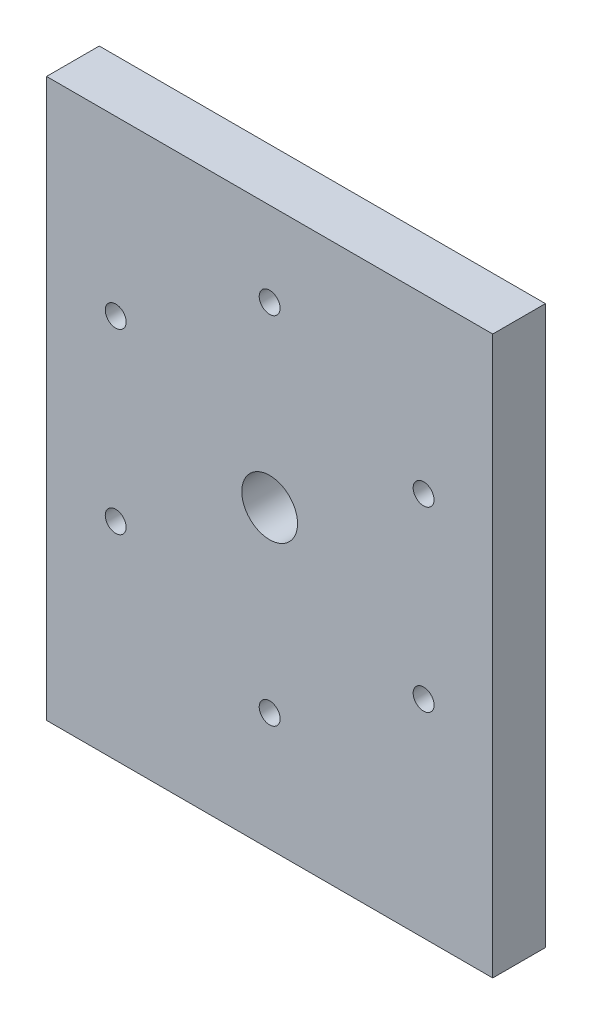
ISO-10303-21;
HEADER;
FILE_DESCRIPTION(('STEP AP214'),'2;1');
FILE_NAME('part.step','',(''),(''),'','','');
FILE_SCHEMA(('AUTOMOTIVE_DESIGN { 1 0 10303 214 1 1 1 1 }'));
ENDSEC;
DATA;
#1=APPLICATION_CONTEXT('core data for automotive mechanical design processes');
#2=APPLICATION_PROTOCOL_DEFINITION('international standard','automotive_design',2000,#1);
#3=PRODUCT_CONTEXT('',#1,'mechanical');
#4=PRODUCT('Part','Part','',(#3));
#5=PRODUCT_RELATED_PRODUCT_CATEGORY('part','',(#4));
#6=PRODUCT_DEFINITION_FORMATION('','',#4);
#7=PRODUCT_DEFINITION_CONTEXT('part definition',#1,'design');
#8=PRODUCT_DEFINITION('design','',#6,#7);
#9=PRODUCT_DEFINITION_SHAPE('','',#8);
#10=(LENGTH_UNIT() NAMED_UNIT(*) SI_UNIT(.MILLI.,.METRE.));
#11=(NAMED_UNIT(*) PLANE_ANGLE_UNIT() SI_UNIT($,.RADIAN.));
#12=(NAMED_UNIT(*) SI_UNIT($,.STERADIAN.) SOLID_ANGLE_UNIT());
#13=UNCERTAINTY_MEASURE_WITH_UNIT(LENGTH_MEASURE(1.E-05),#10,'distance_accuracy_value','');
#14=(GEOMETRIC_REPRESENTATION_CONTEXT(3) GLOBAL_UNCERTAINTY_ASSIGNED_CONTEXT((#13)) GLOBAL_UNIT_ASSIGNED_CONTEXT((#10,
#11,#12)) REPRESENTATION_CONTEXT('',''));
#15=CARTESIAN_POINT('',(0.,0.,0.));
#16=DIRECTION('',(0.,0.,1.));
#17=DIRECTION('',(1.,0.,0.));
#18=AXIS2_PLACEMENT_3D('',#15,#16,#17);
#19=CARTESIAN_POINT('',(0.,0.,12.0000014));
#20=DIRECTION('',(0.,0.,1.));
#21=DIRECTION('',(1.,0.,0.));
#22=AXIS2_PLACEMENT_3D('',#19,#20,#21);
#23=PLANE('',#22);
#24=CARTESIAN_POINT('',(-35.0577908769486,87.6156236000004,12.0000014));
#25=DIRECTION('',(0.,0.,-1.));
#26=DIRECTION('',(-0.50000000000001,-0.866025403784433,0.));
#27=AXIS2_PLACEMENT_3D('',#24,#25,#26);
#28=CIRCLE('',#27,2.38125);
#29=CARTESIAN_POINT('',(-36.2484158769486,85.5534006072387,12.0000014));
#30=VERTEX_POINT('',#29);
#31=EDGE_CURVE('E133',#30,#30,#28,.T.);
#32=ORIENTED_EDGE('',*,*,#31,.T.);
#33=EDGE_LOOP('',(#32));
#34=FACE_BOUND('',#33,.T.);
#35=CARTESIAN_POINT('',(-35.057790876949,47.1343736000003,12.0000014));
#36=DIRECTION('',(0.,0.,-1.));
#37=DIRECTION('',(0.499999999999992,-0.866025403784443,0.));
#38=AXIS2_PLACEMENT_3D('',#35,#36,#37);
#39=CIRCLE('',#38,2.38125);
#40=CARTESIAN_POINT('',(-33.867165876949,45.0721506072386,12.0000014));
#41=VERTEX_POINT('',#40);
#42=EDGE_CURVE('E140',#41,#41,#39,.T.);
#43=ORIENTED_EDGE('',*,*,#42,.T.);
#44=EDGE_LOOP('',(#43));
#45=FACE_BOUND('',#44,.T.);
#46=CARTESIAN_POINT('',(0.,26.8937486,12.0000014));
#47=DIRECTION('',(0.,0.,-1.));
#48=DIRECTION('',(1.,0.,0.));
#49=AXIS2_PLACEMENT_3D('',#46,#47,#48);
#50=CIRCLE('',#49,2.38125);
#51=CARTESIAN_POINT('',(2.38125,26.8937486,12.0000014));
#52=VERTEX_POINT('',#51);
#53=EDGE_CURVE('E146',#52,#52,#50,.T.);
#54=ORIENTED_EDGE('',*,*,#53,.T.);
#55=EDGE_LOOP('',(#54));
#56=FACE_BOUND('',#55,.T.);
#57=CARTESIAN_POINT('',(35.0577908769487,47.1343735999998,12.0000014));
#58=DIRECTION('',(0.,0.,-1.));
#59=DIRECTION('',(0.500000000000004,0.866025403784436,0.));
#60=AXIS2_PLACEMENT_3D('',#57,#58,#59);
#61=CIRCLE('',#60,2.38125);
#62=CARTESIAN_POINT('',(36.2484158769487,49.1965965927615,12.0000014));
#63=VERTEX_POINT('',#62);
#64=EDGE_CURVE('E127',#63,#63,#61,.T.);
#65=ORIENTED_EDGE('',*,*,#64,.T.);
#66=EDGE_LOOP('',(#65));
#67=FACE_BOUND('',#66,.T.);
#68=CARTESIAN_POINT('',(35.0577908769489,87.6156235999999,12.0000014));
#69=DIRECTION('',(0.,0.,-1.));
#70=DIRECTION('',(-0.499999999999998,0.86602540378444,0.));
#71=AXIS2_PLACEMENT_3D('',#68,#69,#70);
#72=CIRCLE('',#71,2.38125);
#73=CARTESIAN_POINT('',(33.8671658769489,89.6778465927616,12.0000014));
#74=VERTEX_POINT('',#73);
#75=EDGE_CURVE('E121',#74,#74,#72,.T.);
#76=ORIENTED_EDGE('',*,*,#75,.T.);
#77=EDGE_LOOP('',(#76));
#78=FACE_BOUND('',#77,.T.);
#79=CARTESIAN_POINT('',(0.,107.8562486,12.0000014));
#80=DIRECTION('',(0.,0.,-1.));
#81=DIRECTION('',(-1.,0.,0.));
#82=AXIS2_PLACEMENT_3D('',#79,#80,#81);
#83=CIRCLE('',#82,2.38125);
#84=CARTESIAN_POINT('',(-2.38125,107.8562486,12.0000014));
#85=VERTEX_POINT('',#84);
#86=EDGE_CURVE('E115',#85,#85,#83,.T.);
#87=ORIENTED_EDGE('',*,*,#86,.T.);
#88=EDGE_LOOP('',(#87));
#89=FACE_BOUND('',#88,.T.);
#90=DIRECTION('',(0.,-1.,0.));
#91=VECTOR('',#90,1.);
#92=CARTESIAN_POINT('',(-50.8,127.,12.0000014));
#93=LINE('',#92,#91);
#94=CARTESIAN_POINT('',(-50.8,127.,12.0000014));
#95=VERTEX_POINT('',#94);
#96=CARTESIAN_POINT('',(-50.7999999999999,0.,12.0000014));
#97=VERTEX_POINT('',#96);
#98=EDGE_CURVE('E85',#95,#97,#93,.T.);
#99=ORIENTED_EDGE('',*,*,#98,.T.);
#100=DIRECTION('',(1.,0.,0.));
#101=VECTOR('',#100,1.);
#102=CARTESIAN_POINT('',(-50.7999999999999,0.,12.0000014));
#103=LINE('',#102,#101);
#104=CARTESIAN_POINT('',(50.8,0.,12.0000014));
#105=VERTEX_POINT('',#104);
#106=EDGE_CURVE('E80',#97,#105,#103,.T.);
#107=ORIENTED_EDGE('',*,*,#106,.T.);
#108=DIRECTION('',(0.,1.,0.));
#109=VECTOR('',#108,1.);
#110=CARTESIAN_POINT('',(50.8,127.,12.0000014));
#111=LINE('',#110,#109);
#112=CARTESIAN_POINT('',(50.8,127.,12.0000014));
#113=VERTEX_POINT('',#112);
#114=EDGE_CURVE('E83',#105,#113,#111,.T.);
#115=ORIENTED_EDGE('',*,*,#114,.T.);
#116=DIRECTION('',(-1.,0.,0.));
#117=VECTOR('',#116,1.);
#118=CARTESIAN_POINT('',(-50.8,127.,12.0000014));
#119=LINE('',#118,#117);
#120=EDGE_CURVE('E50',#113,#95,#119,.T.);
#121=ORIENTED_EDGE('',*,*,#120,.T.);
#122=EDGE_LOOP('',(#99,#107,#115,#121));
#123=FACE_BOUND('',#122,.T.);
#124=CARTESIAN_POINT('',(0.,67.3749986,12.0000014));
#125=DIRECTION('',(0.,0.,1.));
#126=DIRECTION('',(1.,0.,0.));
#127=AXIS2_PLACEMENT_3D('',#124,#125,#126);
#128=CIRCLE('',#127,6.35);
#129=CARTESIAN_POINT('',(6.35,67.3749986,12.0000014));
#130=VERTEX_POINT('',#129);
#131=EDGE_CURVE('E100',#130,#130,#128,.T.);
#132=ORIENTED_EDGE('',*,*,#131,.F.);
#133=EDGE_LOOP('',(#132));
#134=FACE_BOUND('',#133,.T.);
#135=ADVANCED_FACE('F33',(#34,#45,#56,#67,#78,#89,#123,#134),#23,.T.);
#136=CARTESIAN_POINT('',(0.,0.,0.));
#137=DIRECTION('',(0.,0.,1.));
#138=DIRECTION('',(1.,0.,0.));
#139=AXIS2_PLACEMENT_3D('',#136,#137,#138);
#140=PLANE('',#139);
#141=CARTESIAN_POINT('',(-35.0577908769486,87.6156236000004,0.));
#142=DIRECTION('',(0.,0.,-1.));
#143=DIRECTION('',(-0.50000000000001,-0.866025403784433,0.));
#144=AXIS2_PLACEMENT_3D('',#141,#142,#143);
#145=CIRCLE('',#144,2.38125);
#146=CARTESIAN_POINT('',(-36.2484158769486,85.5534006072387,0.));
#147=VERTEX_POINT('',#146);
#148=EDGE_CURVE('E130',#147,#147,#145,.T.);
#149=ORIENTED_EDGE('',*,*,#148,.F.);
#150=EDGE_LOOP('',(#149));
#151=FACE_BOUND('',#150,.T.);
#152=CARTESIAN_POINT('',(-35.057790876949,47.1343736000003,0.));
#153=DIRECTION('',(0.,0.,-1.));
#154=DIRECTION('',(0.499999999999992,-0.866025403784443,0.));
#155=AXIS2_PLACEMENT_3D('',#152,#153,#154);
#156=CIRCLE('',#155,2.38125);
#157=CARTESIAN_POINT('',(-33.867165876949,45.0721506072386,0.));
#158=VERTEX_POINT('',#157);
#159=EDGE_CURVE('E137',#158,#158,#156,.T.);
#160=ORIENTED_EDGE('',*,*,#159,.F.);
#161=EDGE_LOOP('',(#160));
#162=FACE_BOUND('',#161,.T.);
#163=CARTESIAN_POINT('',(0.,26.8937486,0.));
#164=DIRECTION('',(0.,0.,-1.));
#165=DIRECTION('',(1.,0.,0.));
#166=AXIS2_PLACEMENT_3D('',#163,#164,#165);
#167=CIRCLE('',#166,2.38125);
#168=CARTESIAN_POINT('',(2.38125,26.8937486,0.));
#169=VERTEX_POINT('',#168);
#170=EDGE_CURVE('E143',#169,#169,#167,.T.);
#171=ORIENTED_EDGE('',*,*,#170,.F.);
#172=EDGE_LOOP('',(#171));
#173=FACE_BOUND('',#172,.T.);
#174=CARTESIAN_POINT('',(35.0577908769487,47.1343735999998,0.));
#175=DIRECTION('',(0.,0.,-1.));
#176=DIRECTION('',(0.500000000000004,0.866025403784436,0.));
#177=AXIS2_PLACEMENT_3D('',#174,#175,#176);
#178=CIRCLE('',#177,2.38125);
#179=CARTESIAN_POINT('',(36.2484158769487,49.1965965927615,0.));
#180=VERTEX_POINT('',#179);
#181=EDGE_CURVE('E149',#180,#180,#178,.T.);
#182=ORIENTED_EDGE('',*,*,#181,.F.);
#183=EDGE_LOOP('',(#182));
#184=FACE_BOUND('',#183,.T.);
#185=CARTESIAN_POINT('',(35.0577908769489,87.6156235999999,0.));
#186=DIRECTION('',(0.,0.,-1.));
#187=DIRECTION('',(-0.499999999999998,0.86602540378444,0.));
#188=AXIS2_PLACEMENT_3D('',#185,#186,#187);
#189=CIRCLE('',#188,2.38125);
#190=CARTESIAN_POINT('',(33.8671658769489,89.6778465927616,0.));
#191=VERTEX_POINT('',#190);
#192=EDGE_CURVE('E124',#191,#191,#189,.T.);
#193=ORIENTED_EDGE('',*,*,#192,.F.);
#194=EDGE_LOOP('',(#193));
#195=FACE_BOUND('',#194,.T.);
#196=CARTESIAN_POINT('',(0.,107.8562486,0.));
#197=DIRECTION('',(0.,0.,-1.));
#198=DIRECTION('',(-1.,0.,0.));
#199=AXIS2_PLACEMENT_3D('',#196,#197,#198);
#200=CIRCLE('',#199,2.38125);
#201=CARTESIAN_POINT('',(-2.38125,107.8562486,0.));
#202=VERTEX_POINT('',#201);
#203=EDGE_CURVE('E118',#202,#202,#200,.T.);
#204=ORIENTED_EDGE('',*,*,#203,.F.);
#205=EDGE_LOOP('',(#204));
#206=FACE_BOUND('',#205,.T.);
#207=DIRECTION('',(0.,-1.,0.));
#208=VECTOR('',#207,1.);
#209=CARTESIAN_POINT('',(-50.8,127.,0.));
#210=LINE('',#209,#208);
#211=CARTESIAN_POINT('',(-50.8,127.,0.));
#212=VERTEX_POINT('',#211);
#213=CARTESIAN_POINT('',(-50.7999999999999,0.,0.));
#214=VERTEX_POINT('',#213);
#215=EDGE_CURVE('E97',#212,#214,#210,.T.);
#216=ORIENTED_EDGE('',*,*,#215,.F.);
#217=DIRECTION('',(-1.,0.,0.));
#218=VECTOR('',#217,1.);
#219=CARTESIAN_POINT('',(-50.8,127.,0.));
#220=LINE('',#219,#218);
#221=CARTESIAN_POINT('',(50.8,127.,0.));
#222=VERTEX_POINT('',#221);
#223=EDGE_CURVE('E73',#222,#212,#220,.T.);
#224=ORIENTED_EDGE('',*,*,#223,.F.);
#225=DIRECTION('',(0.,1.,0.));
#226=VECTOR('',#225,1.);
#227=CARTESIAN_POINT('',(50.8,127.,0.));
#228=LINE('',#227,#226);
#229=CARTESIAN_POINT('',(50.8,0.,0.));
#230=VERTEX_POINT('',#229);
#231=EDGE_CURVE('E67',#230,#222,#228,.T.);
#232=ORIENTED_EDGE('',*,*,#231,.F.);
#233=DIRECTION('',(1.,0.,0.));
#234=VECTOR('',#233,1.);
#235=CARTESIAN_POINT('',(-50.7999999999999,0.,0.));
#236=LINE('',#235,#234);
#237=EDGE_CURVE('E89',#214,#230,#236,.T.);
#238=ORIENTED_EDGE('',*,*,#237,.F.);
#239=EDGE_LOOP('',(#216,#224,#232,#238));
#240=FACE_BOUND('',#239,.T.);
#241=CARTESIAN_POINT('',(0.,67.3749986,0.));
#242=DIRECTION('',(0.,0.,1.));
#243=DIRECTION('',(1.,0.,0.));
#244=AXIS2_PLACEMENT_3D('',#241,#242,#243);
#245=CIRCLE('',#244,6.35);
#246=CARTESIAN_POINT('',(6.35,67.3749986,0.));
#247=VERTEX_POINT('',#246);
#248=EDGE_CURVE('E112',#247,#247,#245,.T.);
#249=ORIENTED_EDGE('',*,*,#248,.T.);
#250=EDGE_LOOP('',(#249));
#251=FACE_BOUND('',#250,.T.);
#252=ADVANCED_FACE('F108',(#151,#162,#173,#184,#195,#206,#240,#251),#140,.F.);
#253=CARTESIAN_POINT('',(-50.8,127.,12.0000014));
#254=DIRECTION('',(1.,0.,0.));
#255=DIRECTION('',(0.,1.,0.));
#256=AXIS2_PLACEMENT_3D('',#253,#254,#255);
#257=PLANE('',#256);
#258=ORIENTED_EDGE('',*,*,#215,.T.);
#259=DIRECTION('',(0.,0.,-1.));
#260=VECTOR('',#259,1.);
#261=CARTESIAN_POINT('',(-50.7999999999999,0.,12.0000014));
#262=LINE('',#261,#260);
#263=EDGE_CURVE('E11',#97,#214,#262,.T.);
#264=ORIENTED_EDGE('',*,*,#263,.F.);
#265=ORIENTED_EDGE('',*,*,#98,.F.);
#266=DIRECTION('',(0.,0.,-1.));
#267=VECTOR('',#266,1.);
#268=CARTESIAN_POINT('',(-50.8,127.,12.0000014));
#269=LINE('',#268,#267);
#270=EDGE_CURVE('E93',#95,#212,#269,.T.);
#271=ORIENTED_EDGE('',*,*,#270,.T.);
#272=EDGE_LOOP('',(#258,#264,#265,#271));
#273=FACE_BOUND('',#272,.T.);
#274=ADVANCED_FACE('F35',(#273),#257,.F.);
#275=CARTESIAN_POINT('',(-50.7999999999999,0.,12.0000014));
#276=DIRECTION('',(0.,1.,0.));
#277=DIRECTION('',(0.,0.,1.));
#278=AXIS2_PLACEMENT_3D('',#275,#276,#277);
#279=PLANE('',#278);
#280=CARTESIAN_POINT('',(31.75,0.,6.00000070000001));
#281=DIRECTION('',(0.,-1.,0.));
#282=DIRECTION('',(0.,0.,-1.));
#283=AXIS2_PLACEMENT_3D('',#280,#281,#282);
#284=CIRCLE('',#283,2.38125);
#285=CARTESIAN_POINT('',(31.75,0.,3.61875070000001));
#286=VERTEX_POINT('',#285);
#287=EDGE_CURVE('E166',#286,#286,#284,.T.);
#288=ORIENTED_EDGE('',*,*,#287,.F.);
#289=EDGE_LOOP('',(#288));
#290=FACE_BOUND('',#289,.T.);
#291=CARTESIAN_POINT('',(0.,0.,6.00000070000001));
#292=DIRECTION('',(0.,-1.,0.));
#293=DIRECTION('',(0.,0.,-1.));
#294=AXIS2_PLACEMENT_3D('',#291,#292,#293);
#295=CIRCLE('',#294,2.38125);
#296=CARTESIAN_POINT('',(0.,0.,3.61875070000001));
#297=VERTEX_POINT('',#296);
#298=EDGE_CURVE('E160',#297,#297,#295,.T.);
#299=ORIENTED_EDGE('',*,*,#298,.F.);
#300=EDGE_LOOP('',(#299));
#301=FACE_BOUND('',#300,.T.);
#302=CARTESIAN_POINT('',(-31.75,0.,6.00000069999999));
#303=DIRECTION('',(0.,-1.,0.));
#304=DIRECTION('',(0.,0.,-1.));
#305=AXIS2_PLACEMENT_3D('',#302,#303,#304);
#306=CIRCLE('',#305,2.38125);
#307=CARTESIAN_POINT('',(-31.75,0.,3.61875069999999));
#308=VERTEX_POINT('',#307);
#309=EDGE_CURVE('E154',#308,#308,#306,.T.);
#310=ORIENTED_EDGE('',*,*,#309,.F.);
#311=EDGE_LOOP('',(#310));
#312=FACE_BOUND('',#311,.T.);
#313=ORIENTED_EDGE('',*,*,#237,.T.);
#314=DIRECTION('',(0.,0.,-1.));
#315=VECTOR('',#314,1.);
#316=CARTESIAN_POINT('',(50.8,0.,12.0000014));
#317=LINE('',#316,#315);
#318=EDGE_CURVE('E42',#105,#230,#317,.T.);
#319=ORIENTED_EDGE('',*,*,#318,.F.);
#320=ORIENTED_EDGE('',*,*,#106,.F.);
#321=ORIENTED_EDGE('',*,*,#263,.T.);
#322=EDGE_LOOP('',(#313,#319,#320,#321));
#323=FACE_BOUND('',#322,.T.);
#324=ADVANCED_FACE('F88',(#290,#301,#312,#323),#279,.F.);
#325=CARTESIAN_POINT('',(50.8,127.,12.0000014));
#326=DIRECTION('',(-1.,0.,0.));
#327=DIRECTION('',(0.,-1.,0.));
#328=AXIS2_PLACEMENT_3D('',#325,#326,#327);
#329=PLANE('',#328);
#330=ORIENTED_EDGE('',*,*,#231,.T.);
#331=DIRECTION('',(0.,0.,-1.));
#332=VECTOR('',#331,1.);
#333=CARTESIAN_POINT('',(50.8,127.,12.0000014));
#334=LINE('',#333,#332);
#335=EDGE_CURVE('E90',#113,#222,#334,.T.);
#336=ORIENTED_EDGE('',*,*,#335,.F.);
#337=ORIENTED_EDGE('',*,*,#114,.F.);
#338=ORIENTED_EDGE('',*,*,#318,.T.);
#339=EDGE_LOOP('',(#330,#336,#337,#338));
#340=FACE_BOUND('',#339,.T.);
#341=ADVANCED_FACE('F91',(#340),#329,.F.);
#342=CARTESIAN_POINT('',(-50.8,127.,12.0000014));
#343=DIRECTION('',(0.,-1.,0.));
#344=DIRECTION('',(0.,0.,-1.));
#345=AXIS2_PLACEMENT_3D('',#342,#343,#344);
#346=PLANE('',#345);
#347=ORIENTED_EDGE('',*,*,#223,.T.);
#348=ORIENTED_EDGE('',*,*,#270,.F.);
#349=ORIENTED_EDGE('',*,*,#120,.F.);
#350=ORIENTED_EDGE('',*,*,#335,.T.);
#351=EDGE_LOOP('',(#347,#348,#349,#350));
#352=FACE_BOUND('',#351,.T.);
#353=ADVANCED_FACE('F105',(#352),#346,.F.);
#354=CARTESIAN_POINT('',(0.,67.3749986,12.0000014));
#355=DIRECTION('',(0.,0.,-1.));
#356=DIRECTION('',(-1.,0.,0.));
#357=AXIS2_PLACEMENT_3D('',#354,#355,#356);
#358=CYLINDRICAL_SURFACE('',#357,6.35);
#359=ORIENTED_EDGE('',*,*,#131,.T.);
#360=EDGE_LOOP('',(#359));
#361=FACE_BOUND('',#360,.T.);
#362=ORIENTED_EDGE('',*,*,#248,.F.);
#363=EDGE_LOOP('',(#362));
#364=FACE_BOUND('',#363,.T.);
#365=ADVANCED_FACE('F215',(#361,#364),#358,.F.);
#366=CARTESIAN_POINT('',(0.,107.8562486,12.0000014));
#367=DIRECTION('',(0.,0.,-1.));
#368=DIRECTION('',(-1.,0.,0.));
#369=AXIS2_PLACEMENT_3D('',#366,#367,#368);
#370=CYLINDRICAL_SURFACE('',#369,2.38125);
#371=ORIENTED_EDGE('',*,*,#86,.F.);
#372=EDGE_LOOP('',(#371));
#373=FACE_BOUND('',#372,.T.);
#374=ORIENTED_EDGE('',*,*,#203,.T.);
#375=EDGE_LOOP('',(#374));
#376=FACE_BOUND('',#375,.T.);
#377=ADVANCED_FACE('F238',(#373,#376),#370,.F.);
#378=CARTESIAN_POINT('',(35.0577908769489,87.6156235999999,12.0000014));
#379=DIRECTION('',(0.,0.,-1.));
#380=DIRECTION('',(-1.,0.,0.));
#381=AXIS2_PLACEMENT_3D('',#378,#379,#380);
#382=CYLINDRICAL_SURFACE('',#381,2.38125);
#383=ORIENTED_EDGE('',*,*,#75,.F.);
#384=EDGE_LOOP('',(#383));
#385=FACE_BOUND('',#384,.T.);
#386=ORIENTED_EDGE('',*,*,#192,.T.);
#387=EDGE_LOOP('',(#386));
#388=FACE_BOUND('',#387,.T.);
#389=ADVANCED_FACE('F245',(#385,#388),#382,.F.);
#390=CARTESIAN_POINT('',(35.0577908769487,47.1343735999998,12.0000014));
#391=DIRECTION('',(0.,0.,-1.));
#392=DIRECTION('',(-1.,0.,0.));
#393=AXIS2_PLACEMENT_3D('',#390,#391,#392);
#394=CYLINDRICAL_SURFACE('',#393,2.38125);
#395=ORIENTED_EDGE('',*,*,#64,.F.);
#396=EDGE_LOOP('',(#395));
#397=FACE_BOUND('',#396,.T.);
#398=ORIENTED_EDGE('',*,*,#181,.T.);
#399=EDGE_LOOP('',(#398));
#400=FACE_BOUND('',#399,.T.);
#401=ADVANCED_FACE('F252',(#397,#400),#394,.F.);
#402=CARTESIAN_POINT('',(0.,26.8937486,12.0000014));
#403=DIRECTION('',(0.,0.,-1.));
#404=DIRECTION('',(-1.,0.,0.));
#405=AXIS2_PLACEMENT_3D('',#402,#403,#404);
#406=CYLINDRICAL_SURFACE('',#405,2.38125);
#407=ORIENTED_EDGE('',*,*,#53,.F.);
#408=EDGE_LOOP('',(#407));
#409=FACE_BOUND('',#408,.T.);
#410=ORIENTED_EDGE('',*,*,#170,.T.);
#411=EDGE_LOOP('',(#410));
#412=FACE_BOUND('',#411,.T.);
#413=ADVANCED_FACE('F261',(#409,#412),#406,.F.);
#414=CARTESIAN_POINT('',(-35.057790876949,47.1343736000003,12.0000014));
#415=DIRECTION('',(0.,0.,-1.));
#416=DIRECTION('',(-1.,0.,0.));
#417=AXIS2_PLACEMENT_3D('',#414,#415,#416);
#418=CYLINDRICAL_SURFACE('',#417,2.38125);
#419=ORIENTED_EDGE('',*,*,#42,.F.);
#420=EDGE_LOOP('',(#419));
#421=FACE_BOUND('',#420,.T.);
#422=ORIENTED_EDGE('',*,*,#159,.T.);
#423=EDGE_LOOP('',(#422));
#424=FACE_BOUND('',#423,.T.);
#425=ADVANCED_FACE('F200',(#421,#424),#418,.F.);
#426=CARTESIAN_POINT('',(-35.0577908769486,87.6156236000004,12.0000014));
#427=DIRECTION('',(0.,0.,-1.));
#428=DIRECTION('',(-1.,0.,0.));
#429=AXIS2_PLACEMENT_3D('',#426,#427,#428);
#430=CYLINDRICAL_SURFACE('',#429,2.38125);
#431=ORIENTED_EDGE('',*,*,#31,.F.);
#432=EDGE_LOOP('',(#431));
#433=FACE_BOUND('',#432,.T.);
#434=ORIENTED_EDGE('',*,*,#148,.T.);
#435=EDGE_LOOP('',(#434));
#436=FACE_BOUND('',#435,.T.);
#437=ADVANCED_FACE('F190',(#433,#436),#430,.F.);
#438=CARTESIAN_POINT('',(-31.75,12.7,6.00000069999999));
#439=DIRECTION('',(0.,-1.,0.));
#440=DIRECTION('',(0.,0.,-1.));
#441=AXIS2_PLACEMENT_3D('',#438,#439,#440);
#442=CYLINDRICAL_SURFACE('',#441,2.38125);
#443=CARTESIAN_POINT('',(-31.75,12.7,6.00000069999999));
#444=DIRECTION('',(0.,-1.,0.));
#445=DIRECTION('',(0.,0.,-1.));
#446=AXIS2_PLACEMENT_3D('',#443,#444,#445);
#447=CIRCLE('',#446,2.38125);
#448=CARTESIAN_POINT('',(-31.75,12.7,3.61875069999999));
#449=VERTEX_POINT('',#448);
#450=EDGE_CURVE('E157',#449,#449,#447,.T.);
#451=ORIENTED_EDGE('',*,*,#450,.F.);
#452=EDGE_LOOP('',(#451));
#453=FACE_BOUND('',#452,.T.);
#454=ORIENTED_EDGE('',*,*,#309,.T.);
#455=EDGE_LOOP('',(#454));
#456=FACE_BOUND('',#455,.T.);
#457=ADVANCED_FACE('F187',(#453,#456),#442,.F.);
#458=CARTESIAN_POINT('',(-31.75,12.7,6.00000069999999));
#459=DIRECTION('',(0.,-1.,0.));
#460=DIRECTION('',(0.,0.,-1.));
#461=AXIS2_PLACEMENT_3D('',#458,#459,#460);
#462=PLANE('',#461);
#463=ORIENTED_EDGE('',*,*,#450,.T.);
#464=EDGE_LOOP('',(#463));
#465=FACE_BOUND('',#464,.T.);
#466=ADVANCED_FACE('F189',(#465),#462,.T.);
#467=CARTESIAN_POINT('',(0.,12.7,6.00000070000001));
#468=DIRECTION('',(0.,-1.,0.));
#469=DIRECTION('',(0.,0.,-1.));
#470=AXIS2_PLACEMENT_3D('',#467,#468,#469);
#471=CYLINDRICAL_SURFACE('',#470,2.38125);
#472=CARTESIAN_POINT('',(0.,12.7,6.00000070000001));
#473=DIRECTION('',(0.,-1.,0.));
#474=DIRECTION('',(0.,0.,-1.));
#475=AXIS2_PLACEMENT_3D('',#472,#473,#474);
#476=CIRCLE('',#475,2.38125);
#477=CARTESIAN_POINT('',(0.,12.7,3.61875070000001));
#478=VERTEX_POINT('',#477);
#479=EDGE_CURVE('E163',#478,#478,#476,.T.);
#480=ORIENTED_EDGE('',*,*,#479,.F.);
#481=EDGE_LOOP('',(#480));
#482=FACE_BOUND('',#481,.T.);
#483=ORIENTED_EDGE('',*,*,#298,.T.);
#484=EDGE_LOOP('',(#483));
#485=FACE_BOUND('',#484,.T.);
#486=ADVANCED_FACE('F197',(#482,#485),#471,.F.);
#487=CARTESIAN_POINT('',(0.,12.7,6.00000070000001));
#488=DIRECTION('',(0.,-1.,0.));
#489=DIRECTION('',(0.,0.,-1.));
#490=AXIS2_PLACEMENT_3D('',#487,#488,#489);
#491=PLANE('',#490);
#492=ORIENTED_EDGE('',*,*,#479,.T.);
#493=EDGE_LOOP('',(#492));
#494=FACE_BOUND('',#493,.T.);
#495=ADVANCED_FACE('F177',(#494),#491,.T.);
#496=CARTESIAN_POINT('',(31.75,12.7,6.00000070000001));
#497=DIRECTION('',(0.,-1.,0.));
#498=DIRECTION('',(0.,0.,-1.));
#499=AXIS2_PLACEMENT_3D('',#496,#497,#498);
#500=CYLINDRICAL_SURFACE('',#499,2.38125);
#501=CARTESIAN_POINT('',(31.75,12.7,6.00000070000001));
#502=DIRECTION('',(0.,-1.,0.));
#503=DIRECTION('',(0.,0.,-1.));
#504=AXIS2_PLACEMENT_3D('',#501,#502,#503);
#505=CIRCLE('',#504,2.38125);
#506=CARTESIAN_POINT('',(31.75,12.7,3.61875070000001));
#507=VERTEX_POINT('',#506);
#508=EDGE_CURVE('E134',#507,#507,#505,.T.);
#509=ORIENTED_EDGE('',*,*,#508,.F.);
#510=EDGE_LOOP('',(#509));
#511=FACE_BOUND('',#510,.T.);
#512=ORIENTED_EDGE('',*,*,#287,.T.);
#513=EDGE_LOOP('',(#512));
#514=FACE_BOUND('',#513,.T.);
#515=ADVANCED_FACE('F174',(#511,#514),#500,.F.);
#516=CARTESIAN_POINT('',(31.75,12.7,6.00000070000001));
#517=DIRECTION('',(0.,-1.,0.));
#518=DIRECTION('',(0.,0.,-1.));
#519=AXIS2_PLACEMENT_3D('',#516,#517,#518);
#520=PLANE('',#519);
#521=ORIENTED_EDGE('',*,*,#508,.T.);
#522=EDGE_LOOP('',(#521));
#523=FACE_BOUND('',#522,.T.);
#524=ADVANCED_FACE('F172',(#523),#520,.T.);
#525=CLOSED_SHELL('',(#135,#252,#274,#324,#341,#353,#365,#377,#389,#401,#413,#425,#437,#457,
#466,#486,#495,#515,#524));
#526=MANIFOLD_SOLID_BREP('B2',#525);
#527=ADVANCED_BREP_SHAPE_REPRESENTATION('',(#18,#526),#14);
#528=SHAPE_DEFINITION_REPRESENTATION(#9,#527);
ENDSEC;
END-ISO-10303-21;
